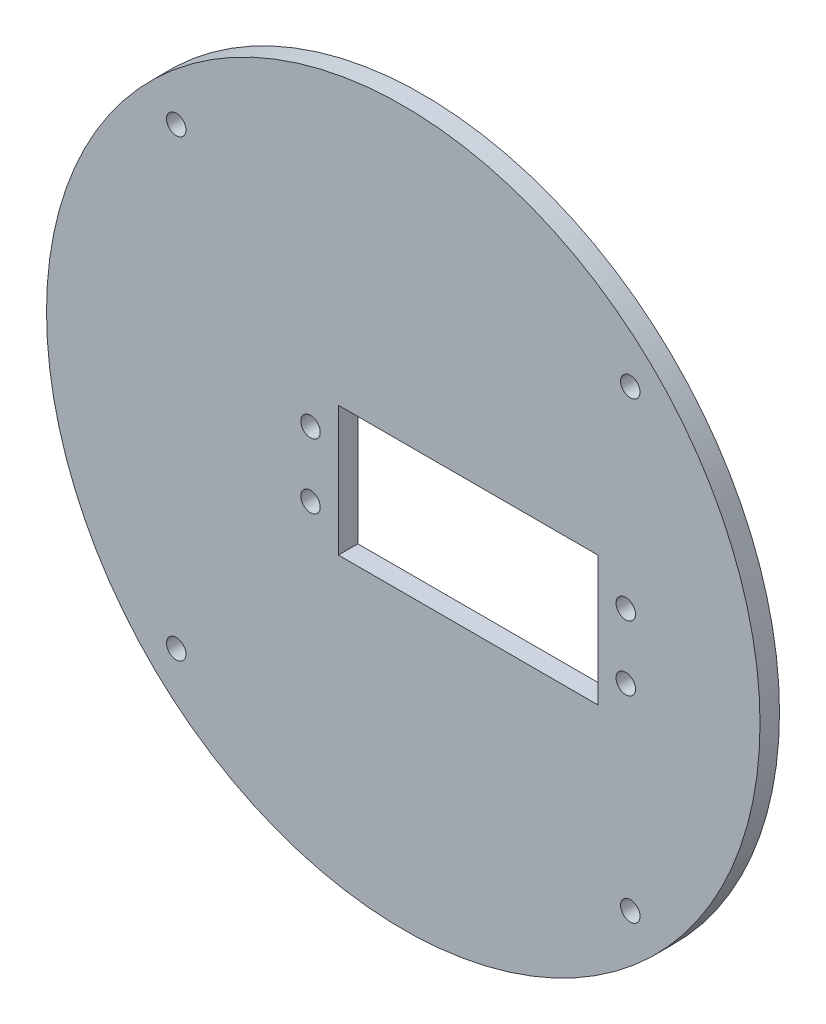
ISO-10303-21;
HEADER;
FILE_DESCRIPTION(('STEP AP214'),'2;1');
FILE_NAME('part.step','',(''),(''),'','','');
FILE_SCHEMA(('AUTOMOTIVE_DESIGN { 1 0 10303 214 1 1 1 1 }'));
ENDSEC;
DATA;
#1=APPLICATION_CONTEXT('core data for automotive mechanical design processes');
#2=APPLICATION_PROTOCOL_DEFINITION('international standard','automotive_design',2000,#1);
#3=PRODUCT_CONTEXT('',#1,'mechanical');
#4=PRODUCT('Part','Part','',(#3));
#5=PRODUCT_RELATED_PRODUCT_CATEGORY('part','',(#4));
#6=PRODUCT_DEFINITION_FORMATION('','',#4);
#7=PRODUCT_DEFINITION_CONTEXT('part definition',#1,'design');
#8=PRODUCT_DEFINITION('design','',#6,#7);
#9=PRODUCT_DEFINITION_SHAPE('','',#8);
#10=(LENGTH_UNIT() NAMED_UNIT(*) SI_UNIT(.MILLI.,.METRE.));
#11=(NAMED_UNIT(*) PLANE_ANGLE_UNIT() SI_UNIT($,.RADIAN.));
#12=(NAMED_UNIT(*) SI_UNIT($,.STERADIAN.) SOLID_ANGLE_UNIT());
#13=UNCERTAINTY_MEASURE_WITH_UNIT(LENGTH_MEASURE(1.E-05),#10,'distance_accuracy_value','');
#14=(GEOMETRIC_REPRESENTATION_CONTEXT(3) GLOBAL_UNCERTAINTY_ASSIGNED_CONTEXT((#13)) GLOBAL_UNIT_ASSIGNED_CONTEXT((#10,
#11,#12)) REPRESENTATION_CONTEXT('',''));
#15=CARTESIAN_POINT('',(0.,0.,0.));
#16=DIRECTION('',(0.,0.,1.));
#17=DIRECTION('',(1.,0.,0.));
#18=AXIS2_PLACEMENT_3D('',#15,#16,#17);
#19=CARTESIAN_POINT('',(0.,-10.,3.));
#20=DIRECTION('',(0.,1.,0.));
#21=DIRECTION('',(0.,0.,1.));
#22=AXIS2_PLACEMENT_3D('',#19,#20,#21);
#23=PLANE('',#22);
#24=DIRECTION('',(1.,0.,0.));
#25=VECTOR('',#24,1.);
#26=CARTESIAN_POINT('',(0.,-10.,0.));
#27=LINE('',#26,#25);
#28=CARTESIAN_POINT('',(-10.,-10.,0.));
#29=VERTEX_POINT('',#28);
#30=CARTESIAN_POINT('',(30.,-10.,0.));
#31=VERTEX_POINT('',#30);
#32=EDGE_CURVE('E132',#29,#31,#27,.T.);
#33=ORIENTED_EDGE('',*,*,#32,.F.);
#34=DIRECTION('',(0.,0.,-1.));
#35=VECTOR('',#34,1.);
#36=CARTESIAN_POINT('',(-10.,-10.,3.));
#37=LINE('',#36,#35);
#38=CARTESIAN_POINT('',(-10.,-10.,3.));
#39=VERTEX_POINT('',#38);
#40=EDGE_CURVE('E11',#39,#29,#37,.T.);
#41=ORIENTED_EDGE('',*,*,#40,.F.);
#42=DIRECTION('',(1.,0.,0.));
#43=VECTOR('',#42,1.);
#44=CARTESIAN_POINT('',(0.,-10.,3.));
#45=LINE('',#44,#43);
#46=CARTESIAN_POINT('',(30.,-10.,3.));
#47=VERTEX_POINT('',#46);
#48=EDGE_CURVE('E98',#39,#47,#45,.T.);
#49=ORIENTED_EDGE('',*,*,#48,.T.);
#50=DIRECTION('',(0.,0.,-1.));
#51=VECTOR('',#50,1.);
#52=CARTESIAN_POINT('',(30.,-10.,3.));
#53=LINE('',#52,#51);
#54=EDGE_CURVE('E76',#47,#31,#53,.T.);
#55=ORIENTED_EDGE('',*,*,#54,.T.);
#56=EDGE_LOOP('',(#33,#41,#49,#55));
#57=FACE_BOUND('',#56,.T.);
#58=ADVANCED_FACE('F36',(#57),#23,.T.);
#59=CARTESIAN_POINT('',(-10.,0.,3.));
#60=DIRECTION('',(1.,0.,0.));
#61=DIRECTION('',(0.,0.,-1.));
#62=AXIS2_PLACEMENT_3D('',#59,#60,#61);
#63=PLANE('',#62);
#64=DIRECTION('',(0.,-1.,0.));
#65=VECTOR('',#64,1.);
#66=CARTESIAN_POINT('',(-10.,0.,0.));
#67=LINE('',#66,#65);
#68=CARTESIAN_POINT('',(-10.,10.,0.));
#69=VERTEX_POINT('',#68);
#70=EDGE_CURVE('E88',#69,#29,#67,.T.);
#71=ORIENTED_EDGE('',*,*,#70,.F.);
#72=DIRECTION('',(0.,0.,-1.));
#73=VECTOR('',#72,1.);
#74=CARTESIAN_POINT('',(-10.,10.,3.));
#75=LINE('',#74,#73);
#76=CARTESIAN_POINT('',(-10.,10.,3.));
#77=VERTEX_POINT('',#76);
#78=EDGE_CURVE('E45',#77,#69,#75,.T.);
#79=ORIENTED_EDGE('',*,*,#78,.F.);
#80=DIRECTION('',(0.,-1.,0.));
#81=VECTOR('',#80,1.);
#82=CARTESIAN_POINT('',(-10.,0.,3.));
#83=LINE('',#82,#81);
#84=EDGE_CURVE('E86',#77,#39,#83,.T.);
#85=ORIENTED_EDGE('',*,*,#84,.T.);
#86=ORIENTED_EDGE('',*,*,#40,.T.);
#87=EDGE_LOOP('',(#71,#79,#85,#86));
#88=FACE_BOUND('',#87,.T.);
#89=ADVANCED_FACE('F84',(#88),#63,.T.);
#90=CARTESIAN_POINT('',(0.,10.,3.));
#91=DIRECTION('',(0.,1.,0.));
#92=DIRECTION('',(0.,0.,1.));
#93=AXIS2_PLACEMENT_3D('',#90,#91,#92);
#94=PLANE('',#93);
#95=DIRECTION('',(1.,0.,0.));
#96=VECTOR('',#95,1.);
#97=CARTESIAN_POINT('',(0.,10.,0.));
#98=LINE('',#97,#96);
#99=CARTESIAN_POINT('',(30.,10.,0.));
#100=VERTEX_POINT('',#99);
#101=EDGE_CURVE('E135',#69,#100,#98,.T.);
#102=ORIENTED_EDGE('',*,*,#101,.T.);
#103=DIRECTION('',(0.,0.,-1.));
#104=VECTOR('',#103,1.);
#105=CARTESIAN_POINT('',(30.,10.,3.));
#106=LINE('',#105,#104);
#107=CARTESIAN_POINT('',(30.,10.,3.));
#108=VERTEX_POINT('',#107);
#109=EDGE_CURVE('E91',#108,#100,#106,.T.);
#110=ORIENTED_EDGE('',*,*,#109,.F.);
#111=DIRECTION('',(1.,0.,0.));
#112=VECTOR('',#111,1.);
#113=CARTESIAN_POINT('',(0.,10.,3.));
#114=LINE('',#113,#112);
#115=EDGE_CURVE('E93',#77,#108,#114,.T.);
#116=ORIENTED_EDGE('',*,*,#115,.F.);
#117=ORIENTED_EDGE('',*,*,#78,.T.);
#118=EDGE_LOOP('',(#102,#110,#116,#117));
#119=FACE_BOUND('',#118,.T.);
#120=ADVANCED_FACE('F94',(#119),#94,.F.);
#121=CARTESIAN_POINT('',(35.,-35.,3.));
#122=DIRECTION('',(0.,0.,-1.));
#123=DIRECTION('',(-1.,0.,0.));
#124=AXIS2_PLACEMENT_3D('',#121,#122,#123);
#125=CYLINDRICAL_SURFACE('',#124,1.5);
#126=CARTESIAN_POINT('',(35.,-35.,3.));
#127=DIRECTION('',(0.,0.,1.));
#128=DIRECTION('',(1.,0.,0.));
#129=AXIS2_PLACEMENT_3D('',#126,#127,#128);
#130=CIRCLE('',#129,1.5);
#131=CARTESIAN_POINT('',(36.5,-35.,3.));
#132=VERTEX_POINT('',#131);
#133=EDGE_CURVE('E120',#132,#132,#130,.T.);
#134=ORIENTED_EDGE('',*,*,#133,.T.);
#135=EDGE_LOOP('',(#134));
#136=FACE_BOUND('',#135,.T.);
#137=CARTESIAN_POINT('',(35.,-35.,0.));
#138=DIRECTION('',(0.,0.,1.));
#139=DIRECTION('',(1.,0.,0.));
#140=AXIS2_PLACEMENT_3D('',#137,#138,#139);
#141=CIRCLE('',#140,1.5);
#142=CARTESIAN_POINT('',(36.5,-35.,0.));
#143=VERTEX_POINT('',#142);
#144=EDGE_CURVE('E153',#143,#143,#141,.T.);
#145=ORIENTED_EDGE('',*,*,#144,.F.);
#146=EDGE_LOOP('',(#145));
#147=FACE_BOUND('',#146,.T.);
#148=ADVANCED_FACE('F200',(#136,#147),#125,.F.);
#149=CARTESIAN_POINT('',(-35.,-35.,3.));
#150=DIRECTION('',(0.,0.,-1.));
#151=DIRECTION('',(-1.,0.,0.));
#152=AXIS2_PLACEMENT_3D('',#149,#150,#151);
#153=CYLINDRICAL_SURFACE('',#152,1.5);
#154=CARTESIAN_POINT('',(-35.,-35.,3.));
#155=DIRECTION('',(0.,0.,1.));
#156=DIRECTION('',(1.,0.,0.));
#157=AXIS2_PLACEMENT_3D('',#154,#155,#156);
#158=CIRCLE('',#157,1.5);
#159=CARTESIAN_POINT('',(-33.5,-35.,3.));
#160=VERTEX_POINT('',#159);
#161=EDGE_CURVE('E117',#160,#160,#158,.T.);
#162=ORIENTED_EDGE('',*,*,#161,.T.);
#163=EDGE_LOOP('',(#162));
#164=FACE_BOUND('',#163,.T.);
#165=CARTESIAN_POINT('',(-35.,-35.,0.));
#166=DIRECTION('',(0.,0.,1.));
#167=DIRECTION('',(1.,0.,0.));
#168=AXIS2_PLACEMENT_3D('',#165,#166,#167);
#169=CIRCLE('',#168,1.5);
#170=CARTESIAN_POINT('',(-33.5,-35.,0.));
#171=VERTEX_POINT('',#170);
#172=EDGE_CURVE('E150',#171,#171,#169,.T.);
#173=ORIENTED_EDGE('',*,*,#172,.F.);
#174=EDGE_LOOP('',(#173));
#175=FACE_BOUND('',#174,.T.);
#176=ADVANCED_FACE('F203',(#164,#175),#153,.F.);
#177=CARTESIAN_POINT('',(35.,35.,3.));
#178=DIRECTION('',(0.,0.,-1.));
#179=DIRECTION('',(-1.,0.,0.));
#180=AXIS2_PLACEMENT_3D('',#177,#178,#179);
#181=CYLINDRICAL_SURFACE('',#180,1.5);
#182=CARTESIAN_POINT('',(35.,35.,3.));
#183=DIRECTION('',(0.,0.,1.));
#184=DIRECTION('',(1.,0.,0.));
#185=AXIS2_PLACEMENT_3D('',#182,#183,#184);
#186=CIRCLE('',#185,1.5);
#187=CARTESIAN_POINT('',(36.5,35.,3.));
#188=VERTEX_POINT('',#187);
#189=EDGE_CURVE('E114',#188,#188,#186,.T.);
#190=ORIENTED_EDGE('',*,*,#189,.T.);
#191=EDGE_LOOP('',(#190));
#192=FACE_BOUND('',#191,.T.);
#193=CARTESIAN_POINT('',(35.,35.,0.));
#194=DIRECTION('',(0.,0.,1.));
#195=DIRECTION('',(1.,0.,0.));
#196=AXIS2_PLACEMENT_3D('',#193,#194,#195);
#197=CIRCLE('',#196,1.5);
#198=CARTESIAN_POINT('',(36.5,35.,0.));
#199=VERTEX_POINT('',#198);
#200=EDGE_CURVE('E147',#199,#199,#197,.T.);
#201=ORIENTED_EDGE('',*,*,#200,.F.);
#202=EDGE_LOOP('',(#201));
#203=FACE_BOUND('',#202,.T.);
#204=ADVANCED_FACE('F207',(#192,#203),#181,.F.);
#205=CARTESIAN_POINT('',(-35.,35.,3.));
#206=DIRECTION('',(0.,0.,-1.));
#207=DIRECTION('',(-1.,0.,0.));
#208=AXIS2_PLACEMENT_3D('',#205,#206,#207);
#209=CYLINDRICAL_SURFACE('',#208,1.5);
#210=CARTESIAN_POINT('',(-35.,35.,3.));
#211=DIRECTION('',(0.,0.,1.));
#212=DIRECTION('',(1.,0.,0.));
#213=AXIS2_PLACEMENT_3D('',#210,#211,#212);
#214=CIRCLE('',#213,1.5);
#215=CARTESIAN_POINT('',(-33.5,35.,3.));
#216=VERTEX_POINT('',#215);
#217=EDGE_CURVE('E111',#216,#216,#214,.T.);
#218=ORIENTED_EDGE('',*,*,#217,.T.);
#219=EDGE_LOOP('',(#218));
#220=FACE_BOUND('',#219,.T.);
#221=CARTESIAN_POINT('',(-35.,35.,0.));
#222=DIRECTION('',(0.,0.,1.));
#223=DIRECTION('',(1.,0.,0.));
#224=AXIS2_PLACEMENT_3D('',#221,#222,#223);
#225=CIRCLE('',#224,1.5);
#226=CARTESIAN_POINT('',(-33.5,35.,0.));
#227=VERTEX_POINT('',#226);
#228=EDGE_CURVE('E144',#227,#227,#225,.T.);
#229=ORIENTED_EDGE('',*,*,#228,.F.);
#230=EDGE_LOOP('',(#229));
#231=FACE_BOUND('',#230,.T.);
#232=ADVANCED_FACE('F211',(#220,#231),#209,.F.);
#233=CARTESIAN_POINT('',(-14.3,5.,3.));
#234=DIRECTION('',(0.,0.,-1.));
#235=DIRECTION('',(-1.,0.,0.));
#236=AXIS2_PLACEMENT_3D('',#233,#234,#235);
#237=CYLINDRICAL_SURFACE('',#236,1.5);
#238=CARTESIAN_POINT('',(-14.3,5.,3.));
#239=DIRECTION('',(0.,0.,1.));
#240=DIRECTION('',(1.,0.,0.));
#241=AXIS2_PLACEMENT_3D('',#238,#239,#240);
#242=CIRCLE('',#241,1.5);
#243=CARTESIAN_POINT('',(-12.8,5.,3.));
#244=VERTEX_POINT('',#243);
#245=EDGE_CURVE('E108',#244,#244,#242,.T.);
#246=ORIENTED_EDGE('',*,*,#245,.T.);
#247=EDGE_LOOP('',(#246));
#248=FACE_BOUND('',#247,.T.);
#249=CARTESIAN_POINT('',(-14.3,5.,0.));
#250=DIRECTION('',(0.,0.,1.));
#251=DIRECTION('',(1.,0.,0.));
#252=AXIS2_PLACEMENT_3D('',#249,#250,#251);
#253=CIRCLE('',#252,1.5);
#254=CARTESIAN_POINT('',(-12.8,5.,0.));
#255=VERTEX_POINT('',#254);
#256=EDGE_CURVE('E141',#255,#255,#253,.T.);
#257=ORIENTED_EDGE('',*,*,#256,.F.);
#258=EDGE_LOOP('',(#257));
#259=FACE_BOUND('',#258,.T.);
#260=ADVANCED_FACE('F215',(#248,#259),#237,.F.);
#261=CARTESIAN_POINT('',(-14.3,-5.,3.));
#262=DIRECTION('',(0.,0.,-1.));
#263=DIRECTION('',(-1.,0.,0.));
#264=AXIS2_PLACEMENT_3D('',#261,#262,#263);
#265=CYLINDRICAL_SURFACE('',#264,1.5);
#266=CARTESIAN_POINT('',(-14.3,-5.,3.));
#267=DIRECTION('',(0.,0.,1.));
#268=DIRECTION('',(1.,0.,0.));
#269=AXIS2_PLACEMENT_3D('',#266,#267,#268);
#270=CIRCLE('',#269,1.5);
#271=CARTESIAN_POINT('',(-12.8,-5.,3.));
#272=VERTEX_POINT('',#271);
#273=EDGE_CURVE('E105',#272,#272,#270,.T.);
#274=ORIENTED_EDGE('',*,*,#273,.T.);
#275=EDGE_LOOP('',(#274));
#276=FACE_BOUND('',#275,.T.);
#277=CARTESIAN_POINT('',(-14.3,-5.,0.));
#278=DIRECTION('',(0.,0.,1.));
#279=DIRECTION('',(1.,0.,0.));
#280=AXIS2_PLACEMENT_3D('',#277,#278,#279);
#281=CIRCLE('',#280,1.5);
#282=CARTESIAN_POINT('',(-12.8,-5.,0.));
#283=VERTEX_POINT('',#282);
#284=EDGE_CURVE('E138',#283,#283,#281,.T.);
#285=ORIENTED_EDGE('',*,*,#284,.F.);
#286=EDGE_LOOP('',(#285));
#287=FACE_BOUND('',#286,.T.);
#288=ADVANCED_FACE('F181',(#276,#287),#265,.F.);
#289=CARTESIAN_POINT('',(30.,0.,3.));
#290=DIRECTION('',(1.,0.,0.));
#291=DIRECTION('',(0.,0.,-1.));
#292=AXIS2_PLACEMENT_3D('',#289,#290,#291);
#293=PLANE('',#292);
#294=DIRECTION('',(0.,-1.,0.));
#295=VECTOR('',#294,1.);
#296=CARTESIAN_POINT('',(30.,0.,0.));
#297=LINE('',#296,#295);
#298=EDGE_CURVE('E69',#100,#31,#297,.T.);
#299=ORIENTED_EDGE('',*,*,#298,.T.);
#300=ORIENTED_EDGE('',*,*,#54,.F.);
#301=DIRECTION('',(0.,-1.,0.));
#302=VECTOR('',#301,1.);
#303=CARTESIAN_POINT('',(30.,0.,3.));
#304=LINE('',#303,#302);
#305=EDGE_CURVE('E53',#108,#47,#304,.T.);
#306=ORIENTED_EDGE('',*,*,#305,.F.);
#307=ORIENTED_EDGE('',*,*,#109,.T.);
#308=EDGE_LOOP('',(#299,#300,#306,#307));
#309=FACE_BOUND('',#308,.T.);
#310=ADVANCED_FACE('F162',(#309),#293,.F.);
#311=CARTESIAN_POINT('',(34.3,5.,3.));
#312=DIRECTION('',(0.,0.,-1.));
#313=DIRECTION('',(-1.,0.,0.));
#314=AXIS2_PLACEMENT_3D('',#311,#312,#313);
#315=CYLINDRICAL_SURFACE('',#314,1.5);
#316=CARTESIAN_POINT('',(34.3,5.,3.));
#317=DIRECTION('',(0.,0.,1.));
#318=DIRECTION('',(1.,0.,0.));
#319=AXIS2_PLACEMENT_3D('',#316,#317,#318);
#320=CIRCLE('',#319,1.5);
#321=CARTESIAN_POINT('',(35.8,5.,3.));
#322=VERTEX_POINT('',#321);
#323=EDGE_CURVE('E100',#322,#322,#320,.T.);
#324=ORIENTED_EDGE('',*,*,#323,.T.);
#325=EDGE_LOOP('',(#324));
#326=FACE_BOUND('',#325,.T.);
#327=CARTESIAN_POINT('',(34.3,5.,0.));
#328=DIRECTION('',(0.,0.,1.));
#329=DIRECTION('',(1.,0.,0.));
#330=AXIS2_PLACEMENT_3D('',#327,#328,#329);
#331=CIRCLE('',#330,1.5);
#332=CARTESIAN_POINT('',(35.8,5.,0.));
#333=VERTEX_POINT('',#332);
#334=EDGE_CURVE('E129',#333,#333,#331,.T.);
#335=ORIENTED_EDGE('',*,*,#334,.F.);
#336=EDGE_LOOP('',(#335));
#337=FACE_BOUND('',#336,.T.);
#338=ADVANCED_FACE('F172',(#326,#337),#315,.F.);
#339=CARTESIAN_POINT('',(34.3,-5.,3.));
#340=DIRECTION('',(0.,0.,-1.));
#341=DIRECTION('',(-1.,0.,0.));
#342=AXIS2_PLACEMENT_3D('',#339,#340,#341);
#343=CYLINDRICAL_SURFACE('',#342,1.5);
#344=CARTESIAN_POINT('',(34.3,-5.,3.));
#345=DIRECTION('',(0.,0.,1.));
#346=DIRECTION('',(1.,0.,0.));
#347=AXIS2_PLACEMENT_3D('',#344,#345,#346);
#348=CIRCLE('',#347,1.5);
#349=CARTESIAN_POINT('',(35.8,-5.,3.));
#350=VERTEX_POINT('',#349);
#351=EDGE_CURVE('E159',#350,#350,#348,.T.);
#352=ORIENTED_EDGE('',*,*,#351,.T.);
#353=EDGE_LOOP('',(#352));
#354=FACE_BOUND('',#353,.T.);
#355=CARTESIAN_POINT('',(34.3,-5.,0.));
#356=DIRECTION('',(0.,0.,1.));
#357=DIRECTION('',(1.,0.,0.));
#358=AXIS2_PLACEMENT_3D('',#355,#356,#357);
#359=CIRCLE('',#358,1.5);
#360=CARTESIAN_POINT('',(35.8,-5.,0.));
#361=VERTEX_POINT('',#360);
#362=EDGE_CURVE('E126',#361,#361,#359,.T.);
#363=ORIENTED_EDGE('',*,*,#362,.F.);
#364=EDGE_LOOP('',(#363));
#365=FACE_BOUND('',#364,.T.);
#366=ADVANCED_FACE('F38',(#354,#365),#343,.F.);
#367=CARTESIAN_POINT('',(0.,0.,3.));
#368=DIRECTION('',(0.,0.,-1.));
#369=DIRECTION('',(-1.,0.,0.));
#370=AXIS2_PLACEMENT_3D('',#367,#368,#369);
#371=CYLINDRICAL_SURFACE('',#370,55.);
#372=CARTESIAN_POINT('',(0.,0.,3.));
#373=DIRECTION('',(0.,0.,1.));
#374=DIRECTION('',(1.,0.,0.));
#375=AXIS2_PLACEMENT_3D('',#372,#373,#374);
#376=CIRCLE('',#375,55.);
#377=CARTESIAN_POINT('',(55.,0.,3.));
#378=VERTEX_POINT('',#377);
#379=EDGE_CURVE('E123',#378,#378,#376,.T.);
#380=ORIENTED_EDGE('',*,*,#379,.F.);
#381=EDGE_LOOP('',(#380));
#382=FACE_BOUND('',#381,.T.);
#383=CARTESIAN_POINT('',(0.,0.,0.));
#384=DIRECTION('',(0.,0.,1.));
#385=DIRECTION('',(1.,0.,0.));
#386=AXIS2_PLACEMENT_3D('',#383,#384,#385);
#387=CIRCLE('',#386,55.);
#388=CARTESIAN_POINT('',(55.,0.,0.));
#389=VERTEX_POINT('',#388);
#390=EDGE_CURVE('E156',#389,#389,#387,.T.);
#391=ORIENTED_EDGE('',*,*,#390,.T.);
#392=EDGE_LOOP('',(#391));
#393=FACE_BOUND('',#392,.T.);
#394=ADVANCED_FACE('F179',(#382,#393),#371,.T.);
#395=CARTESIAN_POINT('',(0.,0.,3.));
#396=DIRECTION('',(0.,0.,1.));
#397=DIRECTION('',(1.,0.,0.));
#398=AXIS2_PLACEMENT_3D('',#395,#396,#397);
#399=PLANE('',#398);
#400=ORIENTED_EDGE('',*,*,#351,.F.);
#401=EDGE_LOOP('',(#400));
#402=FACE_BOUND('',#401,.T.);
#403=ORIENTED_EDGE('',*,*,#323,.F.);
#404=EDGE_LOOP('',(#403));
#405=FACE_BOUND('',#404,.T.);
#406=ORIENTED_EDGE('',*,*,#48,.F.);
#407=ORIENTED_EDGE('',*,*,#84,.F.);
#408=ORIENTED_EDGE('',*,*,#115,.T.);
#409=ORIENTED_EDGE('',*,*,#305,.T.);
#410=EDGE_LOOP('',(#406,#407,#408,#409));
#411=FACE_BOUND('',#410,.T.);
#412=ORIENTED_EDGE('',*,*,#273,.F.);
#413=EDGE_LOOP('',(#412));
#414=FACE_BOUND('',#413,.T.);
#415=ORIENTED_EDGE('',*,*,#245,.F.);
#416=EDGE_LOOP('',(#415));
#417=FACE_BOUND('',#416,.T.);
#418=ORIENTED_EDGE('',*,*,#217,.F.);
#419=EDGE_LOOP('',(#418));
#420=FACE_BOUND('',#419,.T.);
#421=ORIENTED_EDGE('',*,*,#189,.F.);
#422=EDGE_LOOP('',(#421));
#423=FACE_BOUND('',#422,.T.);
#424=ORIENTED_EDGE('',*,*,#161,.F.);
#425=EDGE_LOOP('',(#424));
#426=FACE_BOUND('',#425,.T.);
#427=ORIENTED_EDGE('',*,*,#133,.F.);
#428=EDGE_LOOP('',(#427));
#429=FACE_BOUND('',#428,.T.);
#430=ORIENTED_EDGE('',*,*,#379,.T.);
#431=EDGE_LOOP('',(#430));
#432=FACE_BOUND('',#431,.T.);
#433=ADVANCED_FACE('F96',(#402,#405,#411,#414,#417,#420,#423,#426,#429,#432),#399,.T.);
#434=CARTESIAN_POINT('',(0.,0.,0.));
#435=DIRECTION('',(0.,0.,1.));
#436=DIRECTION('',(1.,0.,0.));
#437=AXIS2_PLACEMENT_3D('',#434,#435,#436);
#438=PLANE('',#437);
#439=ORIENTED_EDGE('',*,*,#362,.T.);
#440=EDGE_LOOP('',(#439));
#441=FACE_BOUND('',#440,.T.);
#442=ORIENTED_EDGE('',*,*,#334,.T.);
#443=EDGE_LOOP('',(#442));
#444=FACE_BOUND('',#443,.T.);
#445=ORIENTED_EDGE('',*,*,#32,.T.);
#446=ORIENTED_EDGE('',*,*,#298,.F.);
#447=ORIENTED_EDGE('',*,*,#101,.F.);
#448=ORIENTED_EDGE('',*,*,#70,.T.);
#449=EDGE_LOOP('',(#445,#446,#447,#448));
#450=FACE_BOUND('',#449,.T.);
#451=ORIENTED_EDGE('',*,*,#284,.T.);
#452=EDGE_LOOP('',(#451));
#453=FACE_BOUND('',#452,.T.);
#454=ORIENTED_EDGE('',*,*,#256,.T.);
#455=EDGE_LOOP('',(#454));
#456=FACE_BOUND('',#455,.T.);
#457=ORIENTED_EDGE('',*,*,#228,.T.);
#458=EDGE_LOOP('',(#457));
#459=FACE_BOUND('',#458,.T.);
#460=ORIENTED_EDGE('',*,*,#200,.T.);
#461=EDGE_LOOP('',(#460));
#462=FACE_BOUND('',#461,.T.);
#463=ORIENTED_EDGE('',*,*,#172,.T.);
#464=EDGE_LOOP('',(#463));
#465=FACE_BOUND('',#464,.T.);
#466=ORIENTED_EDGE('',*,*,#144,.T.);
#467=EDGE_LOOP('',(#466));
#468=FACE_BOUND('',#467,.T.);
#469=ORIENTED_EDGE('',*,*,#390,.F.);
#470=EDGE_LOOP('',(#469));
#471=FACE_BOUND('',#470,.T.);
#472=ADVANCED_FACE('F163',(#441,#444,#450,#453,#456,#459,#462,#465,#468,#471),#438,.F.);
#473=CLOSED_SHELL('',(#58,#89,#120,#148,#176,#204,#232,#260,#288,#310,#338,#366,#394,#433,#472));
#474=MANIFOLD_SOLID_BREP('B2',#473);
#475=ADVANCED_BREP_SHAPE_REPRESENTATION('',(#18,#474),#14);
#476=SHAPE_DEFINITION_REPRESENTATION(#9,#475);
ENDSEC;
END-ISO-10303-21;
